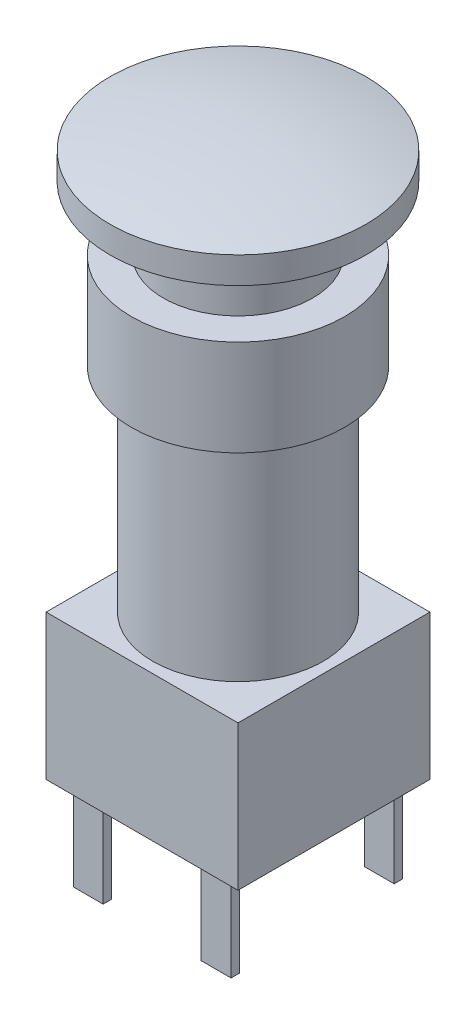
ISO-10303-21;
HEADER;
FILE_DESCRIPTION(('STEP AP214'),'2;1');
FILE_NAME('part.step','',(''),(''),'','','');
FILE_SCHEMA(('AUTOMOTIVE_DESIGN { 1 0 10303 214 1 1 1 1 }'));
ENDSEC;
DATA;
#1=APPLICATION_CONTEXT('core data for automotive mechanical design processes');
#2=APPLICATION_PROTOCOL_DEFINITION('international standard','automotive_design',2000,#1);
#3=PRODUCT_CONTEXT('',#1,'mechanical');
#4=PRODUCT('Part','Part','',(#3));
#5=PRODUCT_RELATED_PRODUCT_CATEGORY('part','',(#4));
#6=PRODUCT_DEFINITION_FORMATION('','',#4);
#7=PRODUCT_DEFINITION_CONTEXT('part definition',#1,'design');
#8=PRODUCT_DEFINITION('design','',#6,#7);
#9=PRODUCT_DEFINITION_SHAPE('','',#8);
#10=(LENGTH_UNIT() NAMED_UNIT(*) SI_UNIT(.MILLI.,.METRE.));
#11=(NAMED_UNIT(*) PLANE_ANGLE_UNIT() SI_UNIT($,.RADIAN.));
#12=(NAMED_UNIT(*) SI_UNIT($,.STERADIAN.) SOLID_ANGLE_UNIT());
#13=UNCERTAINTY_MEASURE_WITH_UNIT(LENGTH_MEASURE(1.E-05),#10,'distance_accuracy_value','');
#14=(GEOMETRIC_REPRESENTATION_CONTEXT(3) GLOBAL_UNCERTAINTY_ASSIGNED_CONTEXT((#13)) GLOBAL_UNIT_ASSIGNED_CONTEXT((#10,
#11,#12)) REPRESENTATION_CONTEXT('',''));
#15=CARTESIAN_POINT('',(0.,0.,0.));
#16=DIRECTION('',(0.,0.,1.));
#17=DIRECTION('',(1.,0.,0.));
#18=AXIS2_PLACEMENT_3D('',#15,#16,#17);
#19=CARTESIAN_POINT('',(0.,-33.6,0.));
#20=DIRECTION('',(0.,1.,0.));
#21=DIRECTION('',(0.,0.,1.));
#22=AXIS2_PLACEMENT_3D('',#19,#20,#21);
#23=PLANE('',#22);
#24=DIRECTION('',(0.,0.,1.));
#25=VECTOR('',#24,1.);
#26=CARTESIAN_POINT('',(7.4,-33.6,-7.25));
#27=LINE('',#26,#25);
#28=CARTESIAN_POINT('',(7.4,-33.6,-8.05));
#29=VERTEX_POINT('',#28);
#30=CARTESIAN_POINT('',(7.4,-33.6,-7.25));
#31=VERTEX_POINT('',#30);
#32=EDGE_CURVE('E194',#29,#31,#27,.T.);
#33=ORIENTED_EDGE('',*,*,#32,.F.);
#34=DIRECTION('',(1.,0.,0.));
#35=VECTOR('',#34,1.);
#36=CARTESIAN_POINT('',(7.4,-33.6,-8.05));
#37=LINE('',#36,#35);
#38=CARTESIAN_POINT('',(4.6,-33.6,-8.05));
#39=VERTEX_POINT('',#38);
#40=EDGE_CURVE('E207',#39,#29,#37,.T.);
#41=ORIENTED_EDGE('',*,*,#40,.F.);
#42=DIRECTION('',(0.,0.,-1.));
#43=VECTOR('',#42,1.);
#44=CARTESIAN_POINT('',(4.6,-33.6,-7.25));
#45=LINE('',#44,#43);
#46=CARTESIAN_POINT('',(4.6,-33.6,-7.25));
#47=VERTEX_POINT('',#46);
#48=EDGE_CURVE('E216',#47,#39,#45,.T.);
#49=ORIENTED_EDGE('',*,*,#48,.F.);
#50=DIRECTION('',(-1.,0.,0.));
#51=VECTOR('',#50,1.);
#52=CARTESIAN_POINT('',(7.4,-33.6,-7.25));
#53=LINE('',#52,#51);
#54=EDGE_CURVE('E197',#31,#47,#53,.T.);
#55=ORIENTED_EDGE('',*,*,#54,.F.);
#56=EDGE_LOOP('',(#33,#41,#49,#55));
#57=FACE_BOUND('',#56,.T.);
#58=DIRECTION('',(0.,0.,-1.));
#59=VECTOR('',#58,1.);
#60=CARTESIAN_POINT('',(-7.4,-33.6,7.25));
#61=LINE('',#60,#59);
#62=CARTESIAN_POINT('',(-7.4,-33.6,8.05));
#63=VERTEX_POINT('',#62);
#64=CARTESIAN_POINT('',(-7.4,-33.6,7.25));
#65=VERTEX_POINT('',#64);
#66=EDGE_CURVE('E265',#63,#65,#61,.T.);
#67=ORIENTED_EDGE('',*,*,#66,.F.);
#68=DIRECTION('',(-1.,0.,0.));
#69=VECTOR('',#68,1.);
#70=CARTESIAN_POINT('',(-7.4,-33.6,8.05));
#71=LINE('',#70,#69);
#72=CARTESIAN_POINT('',(-4.6,-33.6,8.05));
#73=VERTEX_POINT('',#72);
#74=EDGE_CURVE('E270',#73,#63,#71,.T.);
#75=ORIENTED_EDGE('',*,*,#74,.F.);
#76=DIRECTION('',(0.,0.,1.));
#77=VECTOR('',#76,1.);
#78=CARTESIAN_POINT('',(-4.6,-33.6,7.25));
#79=LINE('',#78,#77);
#80=CARTESIAN_POINT('',(-4.6,-33.6,7.25));
#81=VERTEX_POINT('',#80);
#82=EDGE_CURVE('E282',#81,#73,#79,.T.);
#83=ORIENTED_EDGE('',*,*,#82,.F.);
#84=DIRECTION('',(1.,0.,0.));
#85=VECTOR('',#84,1.);
#86=CARTESIAN_POINT('',(-7.4,-33.6,7.25));
#87=LINE('',#86,#85);
#88=EDGE_CURVE('E279',#65,#81,#87,.T.);
#89=ORIENTED_EDGE('',*,*,#88,.F.);
#90=EDGE_LOOP('',(#67,#75,#83,#89));
#91=FACE_BOUND('',#90,.T.);
#92=DIRECTION('',(0.,0.,1.));
#93=VECTOR('',#92,1.);
#94=CARTESIAN_POINT('',(9.,-33.6,-9.));
#95=LINE('',#94,#93);
#96=CARTESIAN_POINT('',(9.,-33.6,-9.));
#97=VERTEX_POINT('',#96);
#98=CARTESIAN_POINT('',(9.,-33.6,9.));
#99=VERTEX_POINT('',#98);
#100=EDGE_CURVE('E299',#97,#99,#95,.T.);
#101=ORIENTED_EDGE('',*,*,#100,.T.);
#102=DIRECTION('',(-1.,0.,0.));
#103=VECTOR('',#102,1.);
#104=CARTESIAN_POINT('',(-9.,-33.6,9.));
#105=LINE('',#104,#103);
#106=CARTESIAN_POINT('',(-9.,-33.6,9.));
#107=VERTEX_POINT('',#106);
#108=EDGE_CURVE('E302',#99,#107,#105,.T.);
#109=ORIENTED_EDGE('',*,*,#108,.T.);
#110=DIRECTION('',(0.,0.,-1.));
#111=VECTOR('',#110,1.);
#112=CARTESIAN_POINT('',(-9.,-33.6,-9.));
#113=LINE('',#112,#111);
#114=CARTESIAN_POINT('',(-9.,-33.6,-9.));
#115=VERTEX_POINT('',#114);
#116=EDGE_CURVE('E305',#107,#115,#113,.T.);
#117=ORIENTED_EDGE('',*,*,#116,.T.);
#118=DIRECTION('',(1.,0.,0.));
#119=VECTOR('',#118,1.);
#120=CARTESIAN_POINT('',(-9.,-33.6,-9.));
#121=LINE('',#120,#119);
#122=EDGE_CURVE('E307',#115,#97,#121,.T.);
#123=ORIENTED_EDGE('',*,*,#122,.T.);
#124=EDGE_LOOP('',(#101,#109,#117,#123));
#125=FACE_BOUND('',#124,.T.);
#126=DIRECTION('',(1.,0.,0.));
#127=VECTOR('',#126,1.);
#128=CARTESIAN_POINT('',(7.4,-33.6,7.25));
#129=LINE('',#128,#127);
#130=CARTESIAN_POINT('',(4.6,-33.6,7.25));
#131=VERTEX_POINT('',#130);
#132=CARTESIAN_POINT('',(7.4,-33.6,7.25));
#133=VERTEX_POINT('',#132);
#134=EDGE_CURVE('E232',#131,#133,#129,.T.);
#135=ORIENTED_EDGE('',*,*,#134,.F.);
#136=DIRECTION('',(0.,0.,-1.));
#137=VECTOR('',#136,1.);
#138=CARTESIAN_POINT('',(4.6,-33.6,7.25));
#139=LINE('',#138,#137);
#140=CARTESIAN_POINT('',(4.6,-33.6,8.05));
#141=VERTEX_POINT('',#140);
#142=EDGE_CURVE('E237',#141,#131,#139,.T.);
#143=ORIENTED_EDGE('',*,*,#142,.F.);
#144=DIRECTION('',(-1.,0.,0.));
#145=VECTOR('',#144,1.);
#146=CARTESIAN_POINT('',(7.4,-33.6,8.05));
#147=LINE('',#146,#145);
#148=CARTESIAN_POINT('',(7.4,-33.6,8.05));
#149=VERTEX_POINT('',#148);
#150=EDGE_CURVE('E249',#149,#141,#147,.T.);
#151=ORIENTED_EDGE('',*,*,#150,.F.);
#152=DIRECTION('',(0.,0.,1.));
#153=VECTOR('',#152,1.);
#154=CARTESIAN_POINT('',(7.4,-33.6,7.25));
#155=LINE('',#154,#153);
#156=EDGE_CURVE('E246',#133,#149,#155,.T.);
#157=ORIENTED_EDGE('',*,*,#156,.F.);
#158=EDGE_LOOP('',(#135,#143,#151,#157));
#159=FACE_BOUND('',#158,.T.);
#160=DIRECTION('',(-1.,0.,0.));
#161=VECTOR('',#160,1.);
#162=CARTESIAN_POINT('',(-7.4,-33.6,-7.25));
#163=LINE('',#162,#161);
#164=CARTESIAN_POINT('',(-4.6,-33.6,-7.25));
#165=VERTEX_POINT('',#164);
#166=CARTESIAN_POINT('',(-7.4,-33.6,-7.25));
#167=VERTEX_POINT('',#166);
#168=EDGE_CURVE('E193',#165,#167,#163,.T.);
#169=ORIENTED_EDGE('',*,*,#168,.F.);
#170=DIRECTION('',(0.,0.,1.));
#171=VECTOR('',#170,1.);
#172=CARTESIAN_POINT('',(-4.6,-33.6,-7.25));
#173=LINE('',#172,#171);
#174=CARTESIAN_POINT('',(-4.6,-33.6,-8.05));
#175=VERTEX_POINT('',#174);
#176=EDGE_CURVE('E190',#175,#165,#173,.T.);
#177=ORIENTED_EDGE('',*,*,#176,.F.);
#178=DIRECTION('',(1.,0.,0.));
#179=VECTOR('',#178,1.);
#180=CARTESIAN_POINT('',(-7.4,-33.6,-8.05));
#181=LINE('',#180,#179);
#182=CARTESIAN_POINT('',(-7.4,-33.6,-8.05));
#183=VERTEX_POINT('',#182);
#184=EDGE_CURVE('E56',#183,#175,#181,.T.);
#185=ORIENTED_EDGE('',*,*,#184,.F.);
#186=DIRECTION('',(0.,0.,-1.));
#187=VECTOR('',#186,1.);
#188=CARTESIAN_POINT('',(-7.4,-33.6,-7.25));
#189=LINE('',#188,#187);
#190=EDGE_CURVE('E51',#167,#183,#189,.T.);
#191=ORIENTED_EDGE('',*,*,#190,.F.);
#192=EDGE_LOOP('',(#169,#177,#185,#191));
#193=FACE_BOUND('',#192,.T.);
#194=ADVANCED_FACE('F36',(#57,#91,#125,#159,#193),#23,.F.);
#195=CARTESIAN_POINT('',(0.,-29.75,0.));
#196=DIRECTION('',(0.,-1.,0.));
#197=DIRECTION('',(1.,0.,0.));
#198=AXIS2_PLACEMENT_3D('',#195,#196,#197);
#199=SPHERICAL_SURFACE('',#198,48.7499999999999);
#200=CARTESIAN_POINT('',(0.,17.5,0.));
#201=DIRECTION('',(0.,-1.,0.));
#202=DIRECTION('',(0.,0.,-1.));
#203=AXIS2_PLACEMENT_3D('',#200,#201,#202);
#204=CIRCLE('',#203,12.);
#205=CARTESIAN_POINT('',(0.,17.5,-12.));
#206=VERTEX_POINT('',#205);
#207=EDGE_CURVE('E11',#206,#206,#204,.T.);
#208=ORIENTED_EDGE('',*,*,#207,.F.);
#209=EDGE_LOOP('',(#208));
#210=FACE_BOUND('',#209,.T.);
#211=ADVANCED_FACE('F38',(#210),#199,.T.);
#212=CARTESIAN_POINT('',(0.,19.,0.));
#213=DIRECTION('',(0.,-1.,0.));
#214=DIRECTION('',(0.,0.,-1.));
#215=AXIS2_PLACEMENT_3D('',#212,#213,#214);
#216=CYLINDRICAL_SURFACE('',#215,12.);
#217=ORIENTED_EDGE('',*,*,#207,.T.);
#218=EDGE_LOOP('',(#217));
#219=FACE_BOUND('',#218,.T.);
#220=CARTESIAN_POINT('',(0.,15.,0.));
#221=DIRECTION('',(0.,-1.,0.));
#222=DIRECTION('',(0.,0.,-1.));
#223=AXIS2_PLACEMENT_3D('',#220,#221,#222);
#224=CIRCLE('',#223,12.);
#225=CARTESIAN_POINT('',(0.,15.,-12.));
#226=VERTEX_POINT('',#225);
#227=EDGE_CURVE('E44',#226,#226,#224,.T.);
#228=ORIENTED_EDGE('',*,*,#227,.F.);
#229=EDGE_LOOP('',(#228));
#230=FACE_BOUND('',#229,.T.);
#231=ADVANCED_FACE('F351',(#219,#230),#216,.T.);
#232=CARTESIAN_POINT('',(7.,15.,0.));
#233=DIRECTION('',(0.,-1.,0.));
#234=DIRECTION('',(0.,0.,-1.));
#235=AXIS2_PLACEMENT_3D('',#232,#233,#234);
#236=PLANE('',#235);
#237=ORIENTED_EDGE('',*,*,#227,.T.);
#238=EDGE_LOOP('',(#237));
#239=FACE_BOUND('',#238,.T.);
#240=CARTESIAN_POINT('',(0.,15.,0.));
#241=DIRECTION('',(0.,-1.,0.));
#242=DIRECTION('',(0.,0.,-1.));
#243=AXIS2_PLACEMENT_3D('',#240,#241,#242);
#244=CIRCLE('',#243,7.);
#245=CARTESIAN_POINT('',(0.,15.,-7.));
#246=VERTEX_POINT('',#245);
#247=EDGE_CURVE('E343',#246,#246,#244,.T.);
#248=ORIENTED_EDGE('',*,*,#247,.F.);
#249=EDGE_LOOP('',(#248));
#250=FACE_BOUND('',#249,.T.);
#251=ADVANCED_FACE('F348',(#239,#250),#236,.T.);
#252=CARTESIAN_POINT('',(0.,19.,0.));
#253=DIRECTION('',(0.,-1.,0.));
#254=DIRECTION('',(0.,0.,-1.));
#255=AXIS2_PLACEMENT_3D('',#252,#253,#254);
#256=CYLINDRICAL_SURFACE('',#255,7.);
#257=ORIENTED_EDGE('',*,*,#247,.T.);
#258=EDGE_LOOP('',(#257));
#259=FACE_BOUND('',#258,.T.);
#260=CARTESIAN_POINT('',(0.,9.,0.));
#261=DIRECTION('',(0.,-1.,0.));
#262=DIRECTION('',(0.,0.,-1.));
#263=AXIS2_PLACEMENT_3D('',#260,#261,#262);
#264=CIRCLE('',#263,7.);
#265=CARTESIAN_POINT('',(0.,9.,-7.));
#266=VERTEX_POINT('',#265);
#267=EDGE_CURVE('E340',#266,#266,#264,.T.);
#268=ORIENTED_EDGE('',*,*,#267,.F.);
#269=EDGE_LOOP('',(#268));
#270=FACE_BOUND('',#269,.T.);
#271=ADVANCED_FACE('F358',(#259,#270),#256,.T.);
#272=CARTESIAN_POINT('',(7.,9.,0.));
#273=DIRECTION('',(0.,1.,0.));
#274=DIRECTION('',(0.,0.,1.));
#275=AXIS2_PLACEMENT_3D('',#272,#273,#274);
#276=PLANE('',#275);
#277=ORIENTED_EDGE('',*,*,#267,.T.);
#278=EDGE_LOOP('',(#277));
#279=FACE_BOUND('',#278,.T.);
#280=CARTESIAN_POINT('',(0.,9.,0.));
#281=DIRECTION('',(0.,-1.,0.));
#282=DIRECTION('',(0.,0.,-1.));
#283=AXIS2_PLACEMENT_3D('',#280,#281,#282);
#284=CIRCLE('',#283,10.);
#285=CARTESIAN_POINT('',(0.,9.,-10.));
#286=VERTEX_POINT('',#285);
#287=EDGE_CURVE('E337',#286,#286,#284,.T.);
#288=ORIENTED_EDGE('',*,*,#287,.F.);
#289=EDGE_LOOP('',(#288));
#290=FACE_BOUND('',#289,.T.);
#291=ADVANCED_FACE('F402',(#279,#290),#276,.T.);
#292=CARTESIAN_POINT('',(0.,19.,0.));
#293=DIRECTION('',(0.,-1.,0.));
#294=DIRECTION('',(0.,0.,-1.));
#295=AXIS2_PLACEMENT_3D('',#292,#293,#294);
#296=CYLINDRICAL_SURFACE('',#295,10.);
#297=ORIENTED_EDGE('',*,*,#287,.T.);
#298=EDGE_LOOP('',(#297));
#299=FACE_BOUND('',#298,.T.);
#300=CARTESIAN_POINT('',(0.,0.,0.));
#301=DIRECTION('',(0.,-1.,0.));
#302=DIRECTION('',(0.,0.,-1.));
#303=AXIS2_PLACEMENT_3D('',#300,#301,#302);
#304=CIRCLE('',#303,10.);
#305=CARTESIAN_POINT('',(0.,0.,-10.));
#306=VERTEX_POINT('',#305);
#307=EDGE_CURVE('E334',#306,#306,#304,.T.);
#308=ORIENTED_EDGE('',*,*,#307,.F.);
#309=EDGE_LOOP('',(#308));
#310=FACE_BOUND('',#309,.T.);
#311=ADVANCED_FACE('F398',(#299,#310),#296,.T.);
#312=CARTESIAN_POINT('',(10.,0.,0.));
#313=DIRECTION('',(0.,-1.,0.));
#314=DIRECTION('',(0.,0.,-1.));
#315=AXIS2_PLACEMENT_3D('',#312,#313,#314);
#316=PLANE('',#315);
#317=ORIENTED_EDGE('',*,*,#307,.T.);
#318=EDGE_LOOP('',(#317));
#319=FACE_BOUND('',#318,.T.);
#320=CARTESIAN_POINT('',(0.,0.,0.));
#321=DIRECTION('',(0.,-1.,0.));
#322=DIRECTION('',(0.,0.,-1.));
#323=AXIS2_PLACEMENT_3D('',#320,#321,#322);
#324=CIRCLE('',#323,8.);
#325=CARTESIAN_POINT('',(0.,0.,-8.));
#326=VERTEX_POINT('',#325);
#327=EDGE_CURVE('E331',#326,#326,#324,.T.);
#328=ORIENTED_EDGE('',*,*,#327,.F.);
#329=EDGE_LOOP('',(#328));
#330=FACE_BOUND('',#329,.T.);
#331=ADVANCED_FACE('F394',(#319,#330),#316,.T.);
#332=CARTESIAN_POINT('',(0.,19.,0.));
#333=DIRECTION('',(0.,-1.,0.));
#334=DIRECTION('',(0.,0.,-1.));
#335=AXIS2_PLACEMENT_3D('',#332,#333,#334);
#336=CYLINDRICAL_SURFACE('',#335,8.);
#337=ORIENTED_EDGE('',*,*,#327,.T.);
#338=EDGE_LOOP('',(#337));
#339=FACE_BOUND('',#338,.T.);
#340=CARTESIAN_POINT('',(0.,-20.,0.));
#341=DIRECTION('',(0.,-1.,0.));
#342=DIRECTION('',(0.,0.,-1.));
#343=AXIS2_PLACEMENT_3D('',#340,#341,#342);
#344=CIRCLE('',#343,8.);
#345=CARTESIAN_POINT('',(0.,-20.,-8.));
#346=VERTEX_POINT('',#345);
#347=EDGE_CURVE('E328',#346,#346,#344,.T.);
#348=ORIENTED_EDGE('',*,*,#347,.F.);
#349=EDGE_LOOP('',(#348));
#350=FACE_BOUND('',#349,.T.);
#351=ADVANCED_FACE('F390',(#339,#350),#336,.T.);
#352=CARTESIAN_POINT('',(9.,-33.6,-9.));
#353=DIRECTION('',(-1.,0.,0.));
#354=DIRECTION('',(0.,0.,1.));
#355=AXIS2_PLACEMENT_3D('',#352,#353,#354);
#356=PLANE('',#355);
#357=DIRECTION('',(0.,0.,1.));
#358=VECTOR('',#357,1.);
#359=CARTESIAN_POINT('',(9.,-20.,-9.));
#360=LINE('',#359,#358);
#361=CARTESIAN_POINT('',(9.,-20.,-9.));
#362=VERTEX_POINT('',#361);
#363=CARTESIAN_POINT('',(9.,-20.,9.));
#364=VERTEX_POINT('',#363);
#365=EDGE_CURVE('E298',#362,#364,#360,.T.);
#366=ORIENTED_EDGE('',*,*,#365,.T.);
#367=DIRECTION('',(0.,1.,0.));
#368=VECTOR('',#367,1.);
#369=CARTESIAN_POINT('',(9.,-33.6,9.));
#370=LINE('',#369,#368);
#371=EDGE_CURVE('E325',#99,#364,#370,.T.);
#372=ORIENTED_EDGE('',*,*,#371,.F.);
#373=ORIENTED_EDGE('',*,*,#100,.F.);
#374=DIRECTION('',(0.,1.,0.));
#375=VECTOR('',#374,1.);
#376=CARTESIAN_POINT('',(9.,-33.6,-9.));
#377=LINE('',#376,#375);
#378=EDGE_CURVE('E309',#97,#362,#377,.T.);
#379=ORIENTED_EDGE('',*,*,#378,.T.);
#380=EDGE_LOOP('',(#366,#372,#373,#379));
#381=FACE_BOUND('',#380,.T.);
#382=ADVANCED_FACE('F386',(#381),#356,.F.);
#383=CARTESIAN_POINT('',(-9.,-33.6,9.));
#384=DIRECTION('',(0.,0.,-1.));
#385=DIRECTION('',(-1.,0.,0.));
#386=AXIS2_PLACEMENT_3D('',#383,#384,#385);
#387=PLANE('',#386);
#388=DIRECTION('',(-1.,0.,0.));
#389=VECTOR('',#388,1.);
#390=CARTESIAN_POINT('',(-9.,-20.,9.));
#391=LINE('',#390,#389);
#392=CARTESIAN_POINT('',(-9.,-20.,9.));
#393=VERTEX_POINT('',#392);
#394=EDGE_CURVE('E312',#364,#393,#391,.T.);
#395=ORIENTED_EDGE('',*,*,#394,.T.);
#396=DIRECTION('',(0.,1.,0.));
#397=VECTOR('',#396,1.);
#398=CARTESIAN_POINT('',(-9.,-33.6,9.));
#399=LINE('',#398,#397);
#400=EDGE_CURVE('E322',#107,#393,#399,.T.);
#401=ORIENTED_EDGE('',*,*,#400,.F.);
#402=ORIENTED_EDGE('',*,*,#108,.F.);
#403=ORIENTED_EDGE('',*,*,#371,.T.);
#404=EDGE_LOOP('',(#395,#401,#402,#403));
#405=FACE_BOUND('',#404,.T.);
#406=ADVANCED_FACE('F382',(#405),#387,.F.);
#407=CARTESIAN_POINT('',(-9.,-33.6,-9.));
#408=DIRECTION('',(1.,0.,0.));
#409=DIRECTION('',(0.,0.,-1.));
#410=AXIS2_PLACEMENT_3D('',#407,#408,#409);
#411=PLANE('',#410);
#412=DIRECTION('',(0.,0.,-1.));
#413=VECTOR('',#412,1.);
#414=CARTESIAN_POINT('',(-9.,-20.,-9.));
#415=LINE('',#414,#413);
#416=CARTESIAN_POINT('',(-9.,-20.,-9.));
#417=VERTEX_POINT('',#416);
#418=EDGE_CURVE('E314',#393,#417,#415,.T.);
#419=ORIENTED_EDGE('',*,*,#418,.T.);
#420=DIRECTION('',(0.,1.,0.));
#421=VECTOR('',#420,1.);
#422=CARTESIAN_POINT('',(-9.,-33.6,-9.));
#423=LINE('',#422,#421);
#424=EDGE_CURVE('E319',#115,#417,#423,.T.);
#425=ORIENTED_EDGE('',*,*,#424,.F.);
#426=ORIENTED_EDGE('',*,*,#116,.F.);
#427=ORIENTED_EDGE('',*,*,#400,.T.);
#428=EDGE_LOOP('',(#419,#425,#426,#427));
#429=FACE_BOUND('',#428,.T.);
#430=ADVANCED_FACE('F378',(#429),#411,.F.);
#431=CARTESIAN_POINT('',(-9.,-33.6,-9.));
#432=DIRECTION('',(0.,0.,1.));
#433=DIRECTION('',(1.,0.,0.));
#434=AXIS2_PLACEMENT_3D('',#431,#432,#433);
#435=PLANE('',#434);
#436=DIRECTION('',(1.,0.,0.));
#437=VECTOR('',#436,1.);
#438=CARTESIAN_POINT('',(-9.,-20.,-9.));
#439=LINE('',#438,#437);
#440=EDGE_CURVE('E303',#417,#362,#439,.T.);
#441=ORIENTED_EDGE('',*,*,#440,.T.);
#442=ORIENTED_EDGE('',*,*,#378,.F.);
#443=ORIENTED_EDGE('',*,*,#122,.F.);
#444=ORIENTED_EDGE('',*,*,#424,.T.);
#445=EDGE_LOOP('',(#441,#442,#443,#444));
#446=FACE_BOUND('',#445,.T.);
#447=ADVANCED_FACE('F374',(#446),#435,.F.);
#448=CARTESIAN_POINT('',(0.,-20.,0.));
#449=DIRECTION('',(0.,1.,0.));
#450=DIRECTION('',(0.,0.,1.));
#451=AXIS2_PLACEMENT_3D('',#448,#449,#450);
#452=PLANE('',#451);
#453=ORIENTED_EDGE('',*,*,#347,.T.);
#454=EDGE_LOOP('',(#453));
#455=FACE_BOUND('',#454,.T.);
#456=ORIENTED_EDGE('',*,*,#365,.F.);
#457=ORIENTED_EDGE('',*,*,#440,.F.);
#458=ORIENTED_EDGE('',*,*,#418,.F.);
#459=ORIENTED_EDGE('',*,*,#394,.F.);
#460=EDGE_LOOP('',(#456,#457,#458,#459));
#461=FACE_BOUND('',#460,.T.);
#462=ADVANCED_FACE('F371',(#455,#461),#452,.T.);
#463=CARTESIAN_POINT('',(-7.4,-42.,7.25));
#464=DIRECTION('',(1.,0.,0.));
#465=DIRECTION('',(0.,0.,-1.));
#466=AXIS2_PLACEMENT_3D('',#463,#464,#465);
#467=PLANE('',#466);
#468=ORIENTED_EDGE('',*,*,#66,.T.);
#469=DIRECTION('',(0.,1.,0.));
#470=VECTOR('',#469,1.);
#471=CARTESIAN_POINT('',(-7.4,-42.,7.25));
#472=LINE('',#471,#470);
#473=CARTESIAN_POINT('',(-7.4,-42.,7.25));
#474=VERTEX_POINT('',#473);
#475=EDGE_CURVE('E295',#474,#65,#472,.T.);
#476=ORIENTED_EDGE('',*,*,#475,.F.);
#477=DIRECTION('',(0.,0.,-1.));
#478=VECTOR('',#477,1.);
#479=CARTESIAN_POINT('',(-7.4,-42.,7.25));
#480=LINE('',#479,#478);
#481=CARTESIAN_POINT('',(-7.4,-42.,8.05));
#482=VERTEX_POINT('',#481);
#483=EDGE_CURVE('E266',#482,#474,#480,.T.);
#484=ORIENTED_EDGE('',*,*,#483,.F.);
#485=DIRECTION('',(0.,1.,0.));
#486=VECTOR('',#485,1.);
#487=CARTESIAN_POINT('',(-7.4,-42.,8.05));
#488=LINE('',#487,#486);
#489=EDGE_CURVE('E276',#482,#63,#488,.T.);
#490=ORIENTED_EDGE('',*,*,#489,.T.);
#491=EDGE_LOOP('',(#468,#476,#484,#490));
#492=FACE_BOUND('',#491,.T.);
#493=ADVANCED_FACE('F369',(#492),#467,.F.);
#494=CARTESIAN_POINT('',(-7.4,-42.,7.25));
#495=DIRECTION('',(0.,0.,1.));
#496=DIRECTION('',(1.,0.,0.));
#497=AXIS2_PLACEMENT_3D('',#494,#495,#496);
#498=PLANE('',#497);
#499=ORIENTED_EDGE('',*,*,#88,.T.);
#500=DIRECTION('',(0.,1.,0.));
#501=VECTOR('',#500,1.);
#502=CARTESIAN_POINT('',(-4.6,-42.,7.25));
#503=LINE('',#502,#501);
#504=CARTESIAN_POINT('',(-4.6,-42.,7.25));
#505=VERTEX_POINT('',#504);
#506=EDGE_CURVE('E292',#505,#81,#503,.T.);
#507=ORIENTED_EDGE('',*,*,#506,.F.);
#508=DIRECTION('',(1.,0.,0.));
#509=VECTOR('',#508,1.);
#510=CARTESIAN_POINT('',(-7.4,-42.,7.25));
#511=LINE('',#510,#509);
#512=EDGE_CURVE('E269',#474,#505,#511,.T.);
#513=ORIENTED_EDGE('',*,*,#512,.F.);
#514=ORIENTED_EDGE('',*,*,#475,.T.);
#515=EDGE_LOOP('',(#499,#507,#513,#514));
#516=FACE_BOUND('',#515,.T.);
#517=ADVANCED_FACE('F512',(#516),#498,.F.);
#518=CARTESIAN_POINT('',(-4.6,-42.,7.25));
#519=DIRECTION('',(-1.,0.,0.));
#520=DIRECTION('',(0.,0.,1.));
#521=AXIS2_PLACEMENT_3D('',#518,#519,#520);
#522=PLANE('',#521);
#523=ORIENTED_EDGE('',*,*,#82,.T.);
#524=DIRECTION('',(0.,1.,0.));
#525=VECTOR('',#524,1.);
#526=CARTESIAN_POINT('',(-4.6,-42.,8.05));
#527=LINE('',#526,#525);
#528=CARTESIAN_POINT('',(-4.6,-42.,8.05));
#529=VERTEX_POINT('',#528);
#530=EDGE_CURVE('E289',#529,#73,#527,.T.);
#531=ORIENTED_EDGE('',*,*,#530,.F.);
#532=DIRECTION('',(0.,0.,1.));
#533=VECTOR('',#532,1.);
#534=CARTESIAN_POINT('',(-4.6,-42.,7.25));
#535=LINE('',#534,#533);
#536=EDGE_CURVE('E272',#505,#529,#535,.T.);
#537=ORIENTED_EDGE('',*,*,#536,.F.);
#538=ORIENTED_EDGE('',*,*,#506,.T.);
#539=EDGE_LOOP('',(#523,#531,#537,#538));
#540=FACE_BOUND('',#539,.T.);
#541=ADVANCED_FACE('F509',(#540),#522,.F.);
#542=CARTESIAN_POINT('',(-7.4,-42.,8.05));
#543=DIRECTION('',(0.,0.,-1.));
#544=DIRECTION('',(-1.,0.,0.));
#545=AXIS2_PLACEMENT_3D('',#542,#543,#544);
#546=PLANE('',#545);
#547=ORIENTED_EDGE('',*,*,#74,.T.);
#548=ORIENTED_EDGE('',*,*,#489,.F.);
#549=DIRECTION('',(-1.,0.,0.));
#550=VECTOR('',#549,1.);
#551=CARTESIAN_POINT('',(-7.4,-42.,8.05));
#552=LINE('',#551,#550);
#553=EDGE_CURVE('E274',#529,#482,#552,.T.);
#554=ORIENTED_EDGE('',*,*,#553,.F.);
#555=ORIENTED_EDGE('',*,*,#530,.T.);
#556=EDGE_LOOP('',(#547,#548,#554,#555));
#557=FACE_BOUND('',#556,.T.);
#558=ADVANCED_FACE('F505',(#557),#546,.F.);
#559=CARTESIAN_POINT('',(0.,-42.,0.));
#560=DIRECTION('',(0.,1.,0.));
#561=DIRECTION('',(0.,0.,1.));
#562=AXIS2_PLACEMENT_3D('',#559,#560,#561);
#563=PLANE('',#562);
#564=ORIENTED_EDGE('',*,*,#483,.T.);
#565=ORIENTED_EDGE('',*,*,#512,.T.);
#566=ORIENTED_EDGE('',*,*,#536,.T.);
#567=ORIENTED_EDGE('',*,*,#553,.T.);
#568=EDGE_LOOP('',(#564,#565,#566,#567));
#569=FACE_BOUND('',#568,.T.);
#570=ADVANCED_FACE('F501',(#569),#563,.F.);
#571=CARTESIAN_POINT('',(7.4,-42.,7.25));
#572=DIRECTION('',(0.,0.,1.));
#573=DIRECTION('',(1.,0.,0.));
#574=AXIS2_PLACEMENT_3D('',#571,#572,#573);
#575=PLANE('',#574);
#576=ORIENTED_EDGE('',*,*,#134,.T.);
#577=DIRECTION('',(0.,1.,0.));
#578=VECTOR('',#577,1.);
#579=CARTESIAN_POINT('',(7.4,-42.,7.25));
#580=LINE('',#579,#578);
#581=CARTESIAN_POINT('',(7.4,-42.,7.25));
#582=VERTEX_POINT('',#581);
#583=EDGE_CURVE('E262',#582,#133,#580,.T.);
#584=ORIENTED_EDGE('',*,*,#583,.F.);
#585=DIRECTION('',(1.,0.,0.));
#586=VECTOR('',#585,1.);
#587=CARTESIAN_POINT('',(7.4,-42.,7.25));
#588=LINE('',#587,#586);
#589=CARTESIAN_POINT('',(4.6,-42.,7.25));
#590=VERTEX_POINT('',#589);
#591=EDGE_CURVE('E233',#590,#582,#588,.T.);
#592=ORIENTED_EDGE('',*,*,#591,.F.);
#593=DIRECTION('',(0.,1.,0.));
#594=VECTOR('',#593,1.);
#595=CARTESIAN_POINT('',(4.6,-42.,7.25));
#596=LINE('',#595,#594);
#597=EDGE_CURVE('E243',#590,#131,#596,.T.);
#598=ORIENTED_EDGE('',*,*,#597,.T.);
#599=EDGE_LOOP('',(#576,#584,#592,#598));
#600=FACE_BOUND('',#599,.T.);
#601=ADVANCED_FACE('F497',(#600),#575,.F.);
#602=CARTESIAN_POINT('',(7.4,-42.,7.25));
#603=DIRECTION('',(-1.,0.,0.));
#604=DIRECTION('',(0.,0.,1.));
#605=AXIS2_PLACEMENT_3D('',#602,#603,#604);
#606=PLANE('',#605);
#607=ORIENTED_EDGE('',*,*,#156,.T.);
#608=DIRECTION('',(0.,1.,0.));
#609=VECTOR('',#608,1.);
#610=CARTESIAN_POINT('',(7.4,-42.,8.05));
#611=LINE('',#610,#609);
#612=CARTESIAN_POINT('',(7.4,-42.,8.05));
#613=VERTEX_POINT('',#612);
#614=EDGE_CURVE('E259',#613,#149,#611,.T.);
#615=ORIENTED_EDGE('',*,*,#614,.F.);
#616=DIRECTION('',(0.,0.,1.));
#617=VECTOR('',#616,1.);
#618=CARTESIAN_POINT('',(7.4,-42.,7.25));
#619=LINE('',#618,#617);
#620=EDGE_CURVE('E236',#582,#613,#619,.T.);
#621=ORIENTED_EDGE('',*,*,#620,.F.);
#622=ORIENTED_EDGE('',*,*,#583,.T.);
#623=EDGE_LOOP('',(#607,#615,#621,#622));
#624=FACE_BOUND('',#623,.T.);
#625=ADVANCED_FACE('F493',(#624),#606,.F.);
#626=CARTESIAN_POINT('',(7.4,-42.,8.05));
#627=DIRECTION('',(0.,0.,-1.));
#628=DIRECTION('',(-1.,0.,0.));
#629=AXIS2_PLACEMENT_3D('',#626,#627,#628);
#630=PLANE('',#629);
#631=ORIENTED_EDGE('',*,*,#150,.T.);
#632=DIRECTION('',(0.,1.,0.));
#633=VECTOR('',#632,1.);
#634=CARTESIAN_POINT('',(4.6,-42.,8.05));
#635=LINE('',#634,#633);
#636=CARTESIAN_POINT('',(4.6,-42.,8.05));
#637=VERTEX_POINT('',#636);
#638=EDGE_CURVE('E256',#637,#141,#635,.T.);
#639=ORIENTED_EDGE('',*,*,#638,.F.);
#640=DIRECTION('',(-1.,0.,0.));
#641=VECTOR('',#640,1.);
#642=CARTESIAN_POINT('',(7.4,-42.,8.05));
#643=LINE('',#642,#641);
#644=EDGE_CURVE('E239',#613,#637,#643,.T.);
#645=ORIENTED_EDGE('',*,*,#644,.F.);
#646=ORIENTED_EDGE('',*,*,#614,.T.);
#647=EDGE_LOOP('',(#631,#639,#645,#646));
#648=FACE_BOUND('',#647,.T.);
#649=ADVANCED_FACE('F489',(#648),#630,.F.);
#650=CARTESIAN_POINT('',(4.6,-42.,7.25));
#651=DIRECTION('',(1.,0.,0.));
#652=DIRECTION('',(0.,0.,-1.));
#653=AXIS2_PLACEMENT_3D('',#650,#651,#652);
#654=PLANE('',#653);
#655=ORIENTED_EDGE('',*,*,#142,.T.);
#656=ORIENTED_EDGE('',*,*,#597,.F.);
#657=DIRECTION('',(0.,0.,-1.));
#658=VECTOR('',#657,1.);
#659=CARTESIAN_POINT('',(4.6,-42.,7.25));
#660=LINE('',#659,#658);
#661=EDGE_CURVE('E241',#637,#590,#660,.T.);
#662=ORIENTED_EDGE('',*,*,#661,.F.);
#663=ORIENTED_EDGE('',*,*,#638,.T.);
#664=EDGE_LOOP('',(#655,#656,#662,#663));
#665=FACE_BOUND('',#664,.T.);
#666=ADVANCED_FACE('F485',(#665),#654,.F.);
#667=CARTESIAN_POINT('',(0.,-42.,0.));
#668=DIRECTION('',(0.,1.,0.));
#669=DIRECTION('',(0.,0.,1.));
#670=AXIS2_PLACEMENT_3D('',#667,#668,#669);
#671=PLANE('',#670);
#672=ORIENTED_EDGE('',*,*,#591,.T.);
#673=ORIENTED_EDGE('',*,*,#620,.T.);
#674=ORIENTED_EDGE('',*,*,#644,.T.);
#675=ORIENTED_EDGE('',*,*,#661,.T.);
#676=EDGE_LOOP('',(#672,#673,#674,#675));
#677=FACE_BOUND('',#676,.T.);
#678=ADVANCED_FACE('F481',(#677),#671,.F.);
#679=CARTESIAN_POINT('',(7.4,-42.,-7.25));
#680=DIRECTION('',(-1.,0.,0.));
#681=DIRECTION('',(0.,0.,1.));
#682=AXIS2_PLACEMENT_3D('',#679,#680,#681);
#683=PLANE('',#682);
#684=ORIENTED_EDGE('',*,*,#32,.T.);
#685=DIRECTION('',(0.,1.,0.));
#686=VECTOR('',#685,1.);
#687=CARTESIAN_POINT('',(7.4,-42.,-7.25));
#688=LINE('',#687,#686);
#689=CARTESIAN_POINT('',(7.4,-42.,-7.25));
#690=VERTEX_POINT('',#689);
#691=EDGE_CURVE('E229',#690,#31,#688,.T.);
#692=ORIENTED_EDGE('',*,*,#691,.F.);
#693=DIRECTION('',(0.,0.,1.));
#694=VECTOR('',#693,1.);
#695=CARTESIAN_POINT('',(7.4,-42.,-7.25));
#696=LINE('',#695,#694);
#697=CARTESIAN_POINT('',(7.4,-42.,-8.05));
#698=VERTEX_POINT('',#697);
#699=EDGE_CURVE('E203',#698,#690,#696,.T.);
#700=ORIENTED_EDGE('',*,*,#699,.F.);
#701=DIRECTION('',(0.,1.,0.));
#702=VECTOR('',#701,1.);
#703=CARTESIAN_POINT('',(7.4,-42.,-8.05));
#704=LINE('',#703,#702);
#705=EDGE_CURVE('E212',#698,#29,#704,.T.);
#706=ORIENTED_EDGE('',*,*,#705,.T.);
#707=EDGE_LOOP('',(#684,#692,#700,#706));
#708=FACE_BOUND('',#707,.T.);
#709=ADVANCED_FACE('F477',(#708),#683,.F.);
#710=CARTESIAN_POINT('',(7.4,-42.,-7.25));
#711=DIRECTION('',(0.,0.,-1.));
#712=DIRECTION('',(-1.,0.,0.));
#713=AXIS2_PLACEMENT_3D('',#710,#711,#712);
#714=PLANE('',#713);
#715=ORIENTED_EDGE('',*,*,#54,.T.);
#716=DIRECTION('',(0.,1.,0.));
#717=VECTOR('',#716,1.);
#718=CARTESIAN_POINT('',(4.6,-42.,-7.25));
#719=LINE('',#718,#717);
#720=CARTESIAN_POINT('',(4.6,-42.,-7.25));
#721=VERTEX_POINT('',#720);
#722=EDGE_CURVE('E226',#721,#47,#719,.T.);
#723=ORIENTED_EDGE('',*,*,#722,.F.);
#724=DIRECTION('',(-1.,0.,0.));
#725=VECTOR('',#724,1.);
#726=CARTESIAN_POINT('',(7.4,-42.,-7.25));
#727=LINE('',#726,#725);
#728=EDGE_CURVE('E206',#690,#721,#727,.T.);
#729=ORIENTED_EDGE('',*,*,#728,.F.);
#730=ORIENTED_EDGE('',*,*,#691,.T.);
#731=EDGE_LOOP('',(#715,#723,#729,#730));
#732=FACE_BOUND('',#731,.T.);
#733=ADVANCED_FACE('F473',(#732),#714,.F.);
#734=CARTESIAN_POINT('',(4.6,-42.,-7.25));
#735=DIRECTION('',(1.,0.,0.));
#736=DIRECTION('',(0.,0.,-1.));
#737=AXIS2_PLACEMENT_3D('',#734,#735,#736);
#738=PLANE('',#737);
#739=ORIENTED_EDGE('',*,*,#48,.T.);
#740=DIRECTION('',(0.,1.,0.));
#741=VECTOR('',#740,1.);
#742=CARTESIAN_POINT('',(4.6,-42.,-8.05));
#743=LINE('',#742,#741);
#744=CARTESIAN_POINT('',(4.6,-42.,-8.05));
#745=VERTEX_POINT('',#744);
#746=EDGE_CURVE('E223',#745,#39,#743,.T.);
#747=ORIENTED_EDGE('',*,*,#746,.F.);
#748=DIRECTION('',(0.,0.,-1.));
#749=VECTOR('',#748,1.);
#750=CARTESIAN_POINT('',(4.6,-42.,-7.25));
#751=LINE('',#750,#749);
#752=EDGE_CURVE('E209',#721,#745,#751,.T.);
#753=ORIENTED_EDGE('',*,*,#752,.F.);
#754=ORIENTED_EDGE('',*,*,#722,.T.);
#755=EDGE_LOOP('',(#739,#747,#753,#754));
#756=FACE_BOUND('',#755,.T.);
#757=ADVANCED_FACE('F469',(#756),#738,.F.);
#758=CARTESIAN_POINT('',(7.4,-42.,-8.05));
#759=DIRECTION('',(0.,0.,1.));
#760=DIRECTION('',(1.,0.,0.));
#761=AXIS2_PLACEMENT_3D('',#758,#759,#760);
#762=PLANE('',#761);
#763=ORIENTED_EDGE('',*,*,#40,.T.);
#764=ORIENTED_EDGE('',*,*,#705,.F.);
#765=DIRECTION('',(1.,0.,0.));
#766=VECTOR('',#765,1.);
#767=CARTESIAN_POINT('',(7.4,-42.,-8.05));
#768=LINE('',#767,#766);
#769=EDGE_CURVE('E211',#745,#698,#768,.T.);
#770=ORIENTED_EDGE('',*,*,#769,.F.);
#771=ORIENTED_EDGE('',*,*,#746,.T.);
#772=EDGE_LOOP('',(#763,#764,#770,#771));
#773=FACE_BOUND('',#772,.T.);
#774=ADVANCED_FACE('F465',(#773),#762,.F.);
#775=CARTESIAN_POINT('',(0.,-42.,0.));
#776=DIRECTION('',(0.,1.,0.));
#777=DIRECTION('',(0.,0.,1.));
#778=AXIS2_PLACEMENT_3D('',#775,#776,#777);
#779=PLANE('',#778);
#780=ORIENTED_EDGE('',*,*,#699,.T.);
#781=ORIENTED_EDGE('',*,*,#728,.T.);
#782=ORIENTED_EDGE('',*,*,#752,.T.);
#783=ORIENTED_EDGE('',*,*,#769,.T.);
#784=EDGE_LOOP('',(#780,#781,#782,#783));
#785=FACE_BOUND('',#784,.T.);
#786=ADVANCED_FACE('F462',(#785),#779,.F.);
#787=CARTESIAN_POINT('',(-7.4,-42.,-7.25));
#788=DIRECTION('',(0.,0.,-1.));
#789=DIRECTION('',(-1.,0.,0.));
#790=AXIS2_PLACEMENT_3D('',#787,#788,#789);
#791=PLANE('',#790);
#792=ORIENTED_EDGE('',*,*,#168,.T.);
#793=DIRECTION('',(0.,1.,0.));
#794=VECTOR('',#793,1.);
#795=CARTESIAN_POINT('',(-7.4,-42.,-7.25));
#796=LINE('',#795,#794);
#797=CARTESIAN_POINT('',(-7.4,-42.,-7.25));
#798=VERTEX_POINT('',#797);
#799=EDGE_CURVE('E174',#798,#167,#796,.T.);
#800=ORIENTED_EDGE('',*,*,#799,.F.);
#801=DIRECTION('',(-1.,0.,0.));
#802=VECTOR('',#801,1.);
#803=CARTESIAN_POINT('',(-7.4,-42.,-7.25));
#804=LINE('',#803,#802);
#805=CARTESIAN_POINT('',(-4.6,-42.,-7.25));
#806=VERTEX_POINT('',#805);
#807=EDGE_CURVE('E181',#806,#798,#804,.T.);
#808=ORIENTED_EDGE('',*,*,#807,.F.);
#809=DIRECTION('',(0.,1.,0.));
#810=VECTOR('',#809,1.);
#811=CARTESIAN_POINT('',(-4.6,-42.,-7.25));
#812=LINE('',#811,#810);
#813=EDGE_CURVE('E440',#806,#165,#812,.T.);
#814=ORIENTED_EDGE('',*,*,#813,.T.);
#815=EDGE_LOOP('',(#792,#800,#808,#814));
#816=FACE_BOUND('',#815,.T.);
#817=ADVANCED_FACE('F192',(#816),#791,.F.);
#818=CARTESIAN_POINT('',(-7.4,-42.,-7.25));
#819=DIRECTION('',(1.,0.,0.));
#820=DIRECTION('',(0.,0.,-1.));
#821=AXIS2_PLACEMENT_3D('',#818,#819,#820);
#822=PLANE('',#821);
#823=ORIENTED_EDGE('',*,*,#190,.T.);
#824=DIRECTION('',(0.,1.,0.));
#825=VECTOR('',#824,1.);
#826=CARTESIAN_POINT('',(-7.4,-42.,-8.05));
#827=LINE('',#826,#825);
#828=CARTESIAN_POINT('',(-7.4,-42.,-8.05));
#829=VERTEX_POINT('',#828);
#830=EDGE_CURVE('E177',#829,#183,#827,.T.);
#831=ORIENTED_EDGE('',*,*,#830,.F.);
#832=DIRECTION('',(0.,0.,-1.));
#833=VECTOR('',#832,1.);
#834=CARTESIAN_POINT('',(-7.4,-42.,-7.25));
#835=LINE('',#834,#833);
#836=EDGE_CURVE('E170',#798,#829,#835,.T.);
#837=ORIENTED_EDGE('',*,*,#836,.F.);
#838=ORIENTED_EDGE('',*,*,#799,.T.);
#839=EDGE_LOOP('',(#823,#831,#837,#838));
#840=FACE_BOUND('',#839,.T.);
#841=ADVANCED_FACE('F172',(#840),#822,.F.);
#842=CARTESIAN_POINT('',(-7.4,-42.,-8.05));
#843=DIRECTION('',(0.,0.,1.));
#844=DIRECTION('',(1.,0.,0.));
#845=AXIS2_PLACEMENT_3D('',#842,#843,#844);
#846=PLANE('',#845);
#847=ORIENTED_EDGE('',*,*,#184,.T.);
#848=DIRECTION('',(0.,1.,0.));
#849=VECTOR('',#848,1.);
#850=CARTESIAN_POINT('',(-4.6,-42.,-8.05));
#851=LINE('',#850,#849);
#852=CARTESIAN_POINT('',(-4.6,-42.,-8.05));
#853=VERTEX_POINT('',#852);
#854=EDGE_CURVE('E199',#853,#175,#851,.T.);
#855=ORIENTED_EDGE('',*,*,#854,.F.);
#856=DIRECTION('',(1.,0.,0.));
#857=VECTOR('',#856,1.);
#858=CARTESIAN_POINT('',(-7.4,-42.,-8.05));
#859=LINE('',#858,#857);
#860=EDGE_CURVE('E180',#829,#853,#859,.T.);
#861=ORIENTED_EDGE('',*,*,#860,.F.);
#862=ORIENTED_EDGE('',*,*,#830,.T.);
#863=EDGE_LOOP('',(#847,#855,#861,#862));
#864=FACE_BOUND('',#863,.T.);
#865=ADVANCED_FACE('F449',(#864),#846,.F.);
#866=CARTESIAN_POINT('',(-4.6,-42.,-7.25));
#867=DIRECTION('',(-1.,0.,0.));
#868=DIRECTION('',(0.,0.,1.));
#869=AXIS2_PLACEMENT_3D('',#866,#867,#868);
#870=PLANE('',#869);
#871=ORIENTED_EDGE('',*,*,#176,.T.);
#872=ORIENTED_EDGE('',*,*,#813,.F.);
#873=DIRECTION('',(0.,0.,1.));
#874=VECTOR('',#873,1.);
#875=CARTESIAN_POINT('',(-4.6,-42.,-7.25));
#876=LINE('',#875,#874);
#877=EDGE_CURVE('E186',#853,#806,#876,.T.);
#878=ORIENTED_EDGE('',*,*,#877,.F.);
#879=ORIENTED_EDGE('',*,*,#854,.T.);
#880=EDGE_LOOP('',(#871,#872,#878,#879));
#881=FACE_BOUND('',#880,.T.);
#882=ADVANCED_FACE('F439',(#881),#870,.F.);
#883=CARTESIAN_POINT('',(0.,-42.,0.));
#884=DIRECTION('',(0.,1.,0.));
#885=DIRECTION('',(0.,0.,1.));
#886=AXIS2_PLACEMENT_3D('',#883,#884,#885);
#887=PLANE('',#886);
#888=ORIENTED_EDGE('',*,*,#807,.T.);
#889=ORIENTED_EDGE('',*,*,#836,.T.);
#890=ORIENTED_EDGE('',*,*,#860,.T.);
#891=ORIENTED_EDGE('',*,*,#877,.T.);
#892=EDGE_LOOP('',(#888,#889,#890,#891));
#893=FACE_BOUND('',#892,.T.);
#894=ADVANCED_FACE('F184',(#893),#887,.F.);
#895=CLOSED_SHELL('',(#194,#211,#231,#251,#271,#291,#311,#331,#351,#382,#406,#430,#447,#462,
#493,#517,#541,#558,#570,#601,#625,#649,#666,#678,#709,#733,#757,#774,#786,#817,#841,#865,#882,#894));
#896=MANIFOLD_SOLID_BREP('B2',#895);
#897=ADVANCED_BREP_SHAPE_REPRESENTATION('',(#18,#896),#14);
#898=SHAPE_DEFINITION_REPRESENTATION(#9,#897);
ENDSEC;
END-ISO-10303-21;
